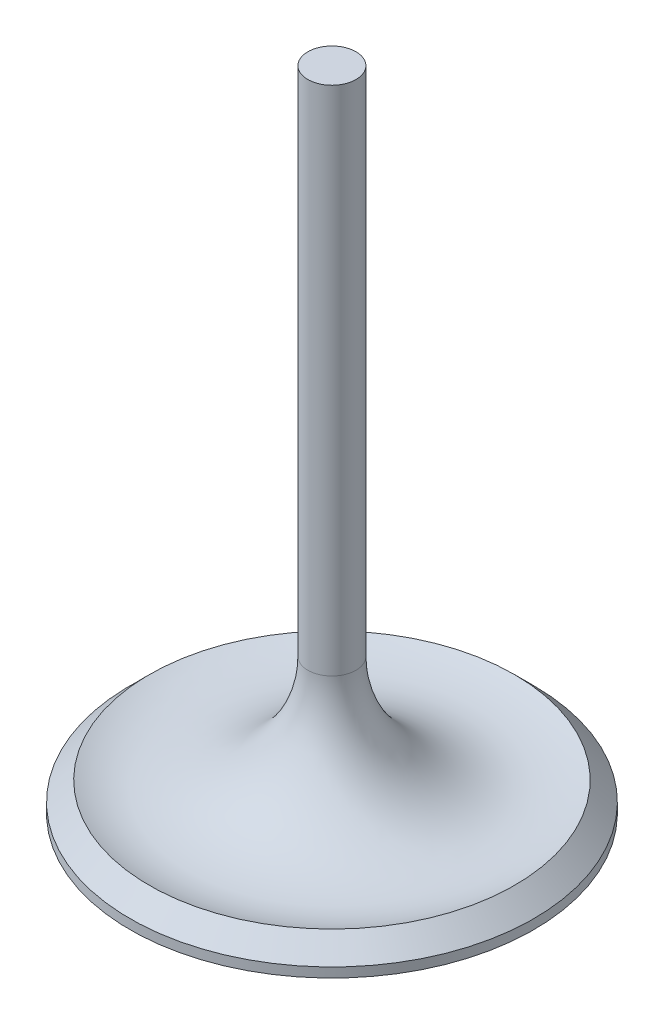
ISO-10303-21;
HEADER;
FILE_DESCRIPTION(('STEP AP214'),'2;1');
FILE_NAME('part.step','',(''),(''),'','','');
FILE_SCHEMA(('AUTOMOTIVE_DESIGN { 1 0 10303 214 1 1 1 1 }'));
ENDSEC;
DATA;
#1=APPLICATION_CONTEXT('core data for automotive mechanical design processes');
#2=APPLICATION_PROTOCOL_DEFINITION('international standard','automotive_design',2000,#1);
#3=PRODUCT_CONTEXT('',#1,'mechanical');
#4=PRODUCT('Part','Part','',(#3));
#5=PRODUCT_RELATED_PRODUCT_CATEGORY('part','',(#4));
#6=PRODUCT_DEFINITION_FORMATION('','',#4);
#7=PRODUCT_DEFINITION_CONTEXT('part definition',#1,'design');
#8=PRODUCT_DEFINITION('design','',#6,#7);
#9=PRODUCT_DEFINITION_SHAPE('','',#8);
#10=(LENGTH_UNIT() NAMED_UNIT(*) SI_UNIT(.MILLI.,.METRE.));
#11=(NAMED_UNIT(*) PLANE_ANGLE_UNIT() SI_UNIT($,.RADIAN.));
#12=(NAMED_UNIT(*) SI_UNIT($,.STERADIAN.) SOLID_ANGLE_UNIT());
#13=UNCERTAINTY_MEASURE_WITH_UNIT(LENGTH_MEASURE(1.E-05),#10,'distance_accuracy_value','');
#14=(GEOMETRIC_REPRESENTATION_CONTEXT(3) GLOBAL_UNCERTAINTY_ASSIGNED_CONTEXT((#13)) GLOBAL_UNIT_ASSIGNED_CONTEXT((#10,
#11,#12)) REPRESENTATION_CONTEXT('',''));
#15=CARTESIAN_POINT('',(0.,0.,0.));
#16=DIRECTION('',(0.,0.,1.));
#17=DIRECTION('',(1.,0.,0.));
#18=AXIS2_PLACEMENT_3D('',#15,#16,#17);
#19=CARTESIAN_POINT('',(26.67,0.,0.));
#20=DIRECTION('',(0.,-1.,0.));
#21=DIRECTION('',(0.,0.,-1.));
#22=AXIS2_PLACEMENT_3D('',#19,#20,#21);
#23=PLANE('',#22);
#24=CARTESIAN_POINT('',(0.,0.,0.));
#25=DIRECTION('',(0.,-1.,0.));
#26=DIRECTION('',(0.,0.,-1.));
#27=AXIS2_PLACEMENT_3D('',#24,#25,#26);
#28=CIRCLE('',#27,26.67);
#29=CARTESIAN_POINT('',(0.,0.,-26.67));
#30=VERTEX_POINT('',#29);
#31=EDGE_CURVE('E10',#30,#30,#28,.T.);
#32=ORIENTED_EDGE('',*,*,#31,.T.);
#33=EDGE_LOOP('',(#32));
#34=FACE_BOUND('',#33,.T.);
#35=ADVANCED_FACE('F31',(#34),#23,.T.);
#36=CARTESIAN_POINT('',(0.,0.,0.));
#37=DIRECTION('',(0.,-1.,0.));
#38=DIRECTION('',(0.,0.,-1.));
#39=AXIS2_PLACEMENT_3D('',#36,#37,#38);
#40=CYLINDRICAL_SURFACE('',#39,26.67);
#41=CARTESIAN_POINT('',(0.,1.27,0.));
#42=DIRECTION('',(0.,-1.,0.));
#43=DIRECTION('',(0.,0.,-1.));
#44=AXIS2_PLACEMENT_3D('',#41,#42,#43);
#45=CIRCLE('',#44,26.67);
#46=CARTESIAN_POINT('',(0.,1.27,-26.67));
#47=VERTEX_POINT('',#46);
#48=EDGE_CURVE('E37',#47,#47,#45,.T.);
#49=ORIENTED_EDGE('',*,*,#48,.T.);
#50=EDGE_LOOP('',(#49));
#51=FACE_BOUND('',#50,.T.);
#52=ORIENTED_EDGE('',*,*,#31,.F.);
#53=EDGE_LOOP('',(#52));
#54=FACE_BOUND('',#53,.T.);
#55=ADVANCED_FACE('F66',(#51,#54),#40,.T.);
#56=CARTESIAN_POINT('',(0.,1.27,0.));
#57=DIRECTION('',(0.,-1.,0.));
#58=DIRECTION('',(0.,0.,-1.));
#59=AXIS2_PLACEMENT_3D('',#56,#57,#58);
#60=CONICAL_SURFACE('',#59,26.67,0.785398163397456);
#61=CARTESIAN_POINT('',(0.,3.80999999999999,0.));
#62=DIRECTION('',(0.,-1.,0.));
#63=DIRECTION('',(0.,0.,-1.));
#64=AXIS2_PLACEMENT_3D('',#61,#62,#63);
#65=CIRCLE('',#64,24.13);
#66=CARTESIAN_POINT('',(0.,3.80999999999999,-24.13));
#67=VERTEX_POINT('',#66);
#68=EDGE_CURVE('E41',#67,#67,#65,.T.);
#69=ORIENTED_EDGE('',*,*,#68,.T.);
#70=EDGE_LOOP('',(#69));
#71=FACE_BOUND('',#70,.T.);
#72=ORIENTED_EDGE('',*,*,#48,.F.);
#73=EDGE_LOOP('',(#72));
#74=FACE_BOUND('',#73,.T.);
#75=ADVANCED_FACE('F70',(#71,#74),#60,.T.);
#76=CARTESIAN_POINT('',(0.,17.9546986535592,0.));
#77=DIRECTION('',(0.,-1.,0.));
#78=DIRECTION('',(0.,0.,-1.));
#79=AXIS2_PLACEMENT_3D('',#76,#77,#78);
#80=TOROIDAL_SURFACE('',#79,18.43,15.25);
#81=CARTESIAN_POINT('',(0.,17.9546986535592,0.));
#82=DIRECTION('',(0.,-1.,0.));
#83=DIRECTION('',(0.,0.,-1.));
#84=AXIS2_PLACEMENT_3D('',#81,#82,#83);
#85=CIRCLE('',#84,3.18000000000001);
#86=CARTESIAN_POINT('',(0.,17.9546986535592,-3.18000000000001));
#87=VERTEX_POINT('',#86);
#88=EDGE_CURVE('E45',#87,#87,#85,.T.);
#89=ORIENTED_EDGE('',*,*,#88,.T.);
#90=EDGE_LOOP('',(#89));
#91=FACE_BOUND('',#90,.T.);
#92=ORIENTED_EDGE('',*,*,#68,.F.);
#93=EDGE_LOOP('',(#92));
#94=FACE_BOUND('',#93,.T.);
#95=ADVANCED_FACE('F63',(#91,#94),#80,.F.);
#96=CARTESIAN_POINT('',(0.,0.,0.));
#97=DIRECTION('',(0.,-1.,0.));
#98=DIRECTION('',(0.,0.,-1.));
#99=AXIS2_PLACEMENT_3D('',#96,#97,#98);
#100=CYLINDRICAL_SURFACE('',#99,3.18000000000001);
#101=CARTESIAN_POINT('',(0.,85.55,0.));
#102=DIRECTION('',(0.,-1.,0.));
#103=DIRECTION('',(0.,0.,-1.));
#104=AXIS2_PLACEMENT_3D('',#101,#102,#103);
#105=CIRCLE('',#104,3.18);
#106=CARTESIAN_POINT('',(0.,85.55,-3.18));
#107=VERTEX_POINT('',#106);
#108=EDGE_CURVE('E50',#107,#107,#105,.T.);
#109=ORIENTED_EDGE('',*,*,#108,.T.);
#110=EDGE_LOOP('',(#109));
#111=FACE_BOUND('',#110,.T.);
#112=ORIENTED_EDGE('',*,*,#88,.F.);
#113=EDGE_LOOP('',(#112));
#114=FACE_BOUND('',#113,.T.);
#115=ADVANCED_FACE('F54',(#111,#114),#100,.T.);
#116=CARTESIAN_POINT('',(0.,85.55,0.));
#117=DIRECTION('',(0.,1.,0.));
#118=DIRECTION('',(0.,0.,1.));
#119=AXIS2_PLACEMENT_3D('',#116,#117,#118);
#120=PLANE('',#119);
#121=ORIENTED_EDGE('',*,*,#108,.F.);
#122=EDGE_LOOP('',(#121));
#123=FACE_BOUND('',#122,.T.);
#124=ADVANCED_FACE('F57',(#123),#120,.T.);
#125=CLOSED_SHELL('',(#35,#55,#75,#95,#115,#124));
#126=MANIFOLD_SOLID_BREP('B2',#125);
#127=ADVANCED_BREP_SHAPE_REPRESENTATION('',(#18,#126),#14);
#128=SHAPE_DEFINITION_REPRESENTATION(#9,#127);
ENDSEC;
END-ISO-10303-21;
